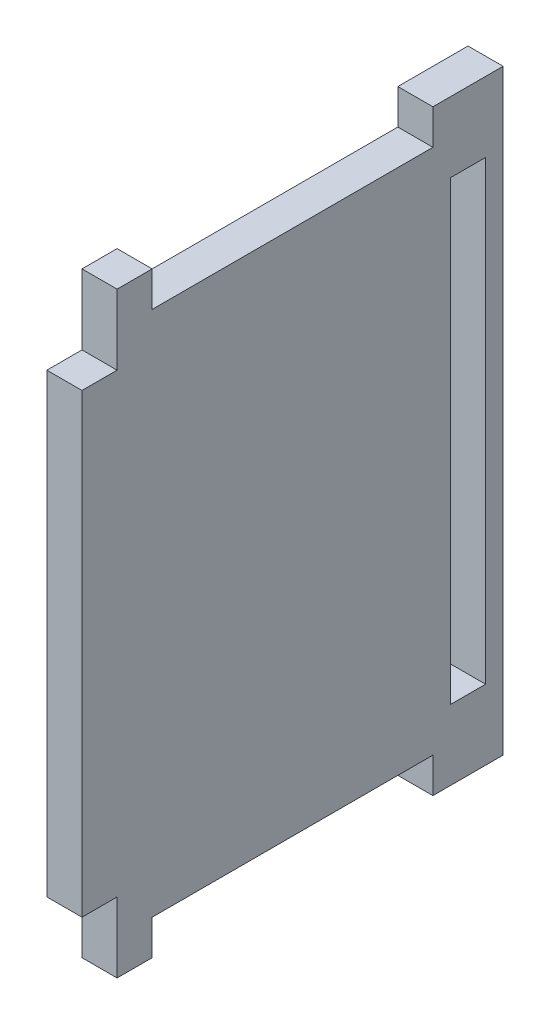
ISO-10303-21;
HEADER;
FILE_DESCRIPTION(('STEP AP214'),'2;1');
FILE_NAME('part.step','',(''),(''),'','','');
FILE_SCHEMA(('AUTOMOTIVE_DESIGN { 1 0 10303 214 1 1 1 1 }'));
ENDSEC;
DATA;
#1=APPLICATION_CONTEXT('core data for automotive mechanical design processes');
#2=APPLICATION_PROTOCOL_DEFINITION('international standard','automotive_design',2000,#1);
#3=PRODUCT_CONTEXT('',#1,'mechanical');
#4=PRODUCT('Part','Part','',(#3));
#5=PRODUCT_RELATED_PRODUCT_CATEGORY('part','',(#4));
#6=PRODUCT_DEFINITION_FORMATION('','',#4);
#7=PRODUCT_DEFINITION_CONTEXT('part definition',#1,'design');
#8=PRODUCT_DEFINITION('design','',#6,#7);
#9=PRODUCT_DEFINITION_SHAPE('','',#8);
#10=(LENGTH_UNIT() NAMED_UNIT(*) SI_UNIT(.MILLI.,.METRE.));
#11=(NAMED_UNIT(*) PLANE_ANGLE_UNIT() SI_UNIT($,.RADIAN.));
#12=(NAMED_UNIT(*) SI_UNIT($,.STERADIAN.) SOLID_ANGLE_UNIT());
#13=UNCERTAINTY_MEASURE_WITH_UNIT(LENGTH_MEASURE(1.E-05),#10,'distance_accuracy_value','');
#14=(GEOMETRIC_REPRESENTATION_CONTEXT(3) GLOBAL_UNCERTAINTY_ASSIGNED_CONTEXT((#13)) GLOBAL_UNIT_ASSIGNED_CONTEXT((#10,
#11,#12)) REPRESENTATION_CONTEXT('',''));
#15=CARTESIAN_POINT('',(0.,0.,0.));
#16=DIRECTION('',(0.,0.,1.));
#17=DIRECTION('',(1.,0.,0.));
#18=AXIS2_PLACEMENT_3D('',#15,#16,#17);
#19=CARTESIAN_POINT('',(82.55,-6.35,184.336603423633));
#20=DIRECTION('',(0.,1.,0.));
#21=DIRECTION('',(-1.,0.,0.));
#22=AXIS2_PLACEMENT_3D('',#19,#20,#21);
#23=PLANE('',#22);
#24=DIRECTION('',(0.,0.,-1.));
#25=VECTOR('',#24,1.);
#26=CARTESIAN_POINT('',(82.55,-6.35,184.336603423633));
#27=LINE('',#26,#25);
#28=CARTESIAN_POINT('',(82.55,-6.35,12.7));
#29=VERTEX_POINT('',#28);
#30=CARTESIAN_POINT('',(82.55,-6.35,0.));
#31=VERTEX_POINT('',#30);
#32=EDGE_CURVE('E311',#29,#31,#27,.T.);
#33=ORIENTED_EDGE('',*,*,#32,.F.);
#34=DIRECTION('',(1.,0.,0.));
#35=VECTOR('',#34,1.);
#36=CARTESIAN_POINT('',(76.2,-6.35,12.7));
#37=LINE('',#36,#35);
#38=CARTESIAN_POINT('',(76.2,-6.35,12.7));
#39=VERTEX_POINT('',#38);
#40=EDGE_CURVE('E201',#39,#29,#37,.T.);
#41=ORIENTED_EDGE('',*,*,#40,.F.);
#42=DIRECTION('',(0.,0.,-1.));
#43=VECTOR('',#42,1.);
#44=CARTESIAN_POINT('',(76.2,-6.35,184.336603423633));
#45=LINE('',#44,#43);
#46=CARTESIAN_POINT('',(76.2,-6.35,0.));
#47=VERTEX_POINT('',#46);
#48=EDGE_CURVE('E192',#39,#47,#45,.T.);
#49=ORIENTED_EDGE('',*,*,#48,.T.);
#50=DIRECTION('',(1.,0.,0.));
#51=VECTOR('',#50,1.);
#52=CARTESIAN_POINT('',(82.55,-6.35,0.));
#53=LINE('',#52,#51);
#54=EDGE_CURVE('E308',#47,#31,#53,.T.);
#55=ORIENTED_EDGE('',*,*,#54,.T.);
#56=EDGE_LOOP('',(#33,#41,#49,#55));
#57=FACE_BOUND('',#56,.T.);
#58=ADVANCED_FACE('F33',(#57),#23,.F.);
#59=CARTESIAN_POINT('',(82.55,101.6,184.336603423633));
#60=DIRECTION('',(0.,-1.,0.));
#61=DIRECTION('',(0.,0.,-1.));
#62=AXIS2_PLACEMENT_3D('',#59,#60,#61);
#63=PLANE('',#62);
#64=DIRECTION('',(0.,0.,-1.));
#65=VECTOR('',#64,1.);
#66=CARTESIAN_POINT('',(82.55,101.6,184.336603423633));
#67=LINE('',#66,#65);
#68=CARTESIAN_POINT('',(82.55,101.6,69.85));
#69=VERTEX_POINT('',#68);
#70=CARTESIAN_POINT('',(82.55,101.6,63.5));
#71=VERTEX_POINT('',#70);
#72=EDGE_CURVE('E37',#69,#71,#67,.T.);
#73=ORIENTED_EDGE('',*,*,#72,.T.);
#74=DIRECTION('',(1.,0.,0.));
#75=VECTOR('',#74,1.);
#76=CARTESIAN_POINT('',(76.2,101.6,63.5));
#77=LINE('',#76,#75);
#78=CARTESIAN_POINT('',(76.2,101.6,63.5));
#79=VERTEX_POINT('',#78);
#80=EDGE_CURVE('E257',#79,#71,#77,.T.);
#81=ORIENTED_EDGE('',*,*,#80,.F.);
#82=DIRECTION('',(0.,0.,-1.));
#83=VECTOR('',#82,1.);
#84=CARTESIAN_POINT('',(76.2,101.6,184.336603423633));
#85=LINE('',#84,#83);
#86=CARTESIAN_POINT('',(76.2,101.6,69.85));
#87=VERTEX_POINT('',#86);
#88=EDGE_CURVE('E318',#87,#79,#85,.T.);
#89=ORIENTED_EDGE('',*,*,#88,.F.);
#90=DIRECTION('',(1.,0.,0.));
#91=VECTOR('',#90,1.);
#92=CARTESIAN_POINT('',(76.2,101.6,69.85));
#93=LINE('',#92,#91);
#94=EDGE_CURVE('E293',#87,#69,#93,.T.);
#95=ORIENTED_EDGE('',*,*,#94,.T.);
#96=EDGE_LOOP('',(#73,#81,#89,#95));
#97=FACE_BOUND('',#96,.T.);
#98=ADVANCED_FACE('F367',(#97),#63,.F.);
#99=CARTESIAN_POINT('',(0.,0.,0.));
#100=DIRECTION('',(0.,0.,1.));
#101=DIRECTION('',(1.,0.,0.));
#102=AXIS2_PLACEMENT_3D('',#99,#100,#101);
#103=PLANE('',#102);
#104=DIRECTION('',(0.,1.,0.));
#105=VECTOR('',#104,1.);
#106=CARTESIAN_POINT('',(82.55,-6.35,0.));
#107=LINE('',#106,#105);
#108=CARTESIAN_POINT('',(82.55,101.6,0.));
#109=VERTEX_POINT('',#108);
#110=EDGE_CURVE('E296',#31,#109,#107,.T.);
#111=ORIENTED_EDGE('',*,*,#110,.F.);
#112=ORIENTED_EDGE('',*,*,#54,.F.);
#113=DIRECTION('',(0.,-1.,0.));
#114=VECTOR('',#113,1.);
#115=CARTESIAN_POINT('',(76.2,-6.35,0.));
#116=LINE('',#115,#114);
#117=CARTESIAN_POINT('',(76.2,101.6,0.));
#118=VERTEX_POINT('',#117);
#119=EDGE_CURVE('E306',#118,#47,#116,.T.);
#120=ORIENTED_EDGE('',*,*,#119,.F.);
#121=DIRECTION('',(-1.,0.,0.));
#122=VECTOR('',#121,1.);
#123=CARTESIAN_POINT('',(82.55,101.6,0.));
#124=LINE('',#123,#122);
#125=EDGE_CURVE('E303',#109,#118,#124,.T.);
#126=ORIENTED_EDGE('',*,*,#125,.F.);
#127=EDGE_LOOP('',(#111,#112,#120,#126));
#128=FACE_BOUND('',#127,.T.);
#129=ADVANCED_FACE('F332',(#128),#103,.F.);
#130=CARTESIAN_POINT('',(76.2,-6.35,69.85));
#131=VERTEX_POINT('',#130);
#132=CARTESIAN_POINT('',(76.2,-6.35,63.5));
#133=VERTEX_POINT('',#132);
#134=EDGE_CURVE('E315',#131,#133,#45,.T.);
#135=ORIENTED_EDGE('',*,*,#134,.T.);
#136=DIRECTION('',(1.,0.,0.));
#137=VECTOR('',#136,1.);
#138=CARTESIAN_POINT('',(76.2,-6.35,63.5));
#139=LINE('',#138,#137);
#140=CARTESIAN_POINT('',(82.55,-6.35,63.5));
#141=VERTEX_POINT('',#140);
#142=EDGE_CURVE('E204',#133,#141,#139,.T.);
#143=ORIENTED_EDGE('',*,*,#142,.T.);
#144=CARTESIAN_POINT('',(82.55,-6.35,69.85));
#145=VERTEX_POINT('',#144);
#146=EDGE_CURVE('E312',#145,#141,#27,.T.);
#147=ORIENTED_EDGE('',*,*,#146,.F.);
#148=DIRECTION('',(1.,0.,0.));
#149=VECTOR('',#148,1.);
#150=CARTESIAN_POINT('',(76.2,-6.35,69.85));
#151=LINE('',#150,#149);
#152=EDGE_CURVE('E271',#131,#145,#151,.T.);
#153=ORIENTED_EDGE('',*,*,#152,.F.);
#154=EDGE_LOOP('',(#135,#143,#147,#153));
#155=FACE_BOUND('',#154,.T.);
#156=ADVANCED_FACE('F342',(#155),#23,.F.);
#157=CARTESIAN_POINT('',(76.2,-6.35,184.336603423633));
#158=DIRECTION('',(1.,0.,0.));
#159=DIRECTION('',(0.,0.,-1.));
#160=AXIS2_PLACEMENT_3D('',#157,#158,#159);
#161=PLANE('',#160);
#162=ORIENTED_EDGE('',*,*,#48,.F.);
#163=DIRECTION('',(0.,1.,0.));
#164=VECTOR('',#163,1.);
#165=CARTESIAN_POINT('',(76.2,-6.35,12.7));
#166=LINE('',#165,#164);
#167=CARTESIAN_POINT('',(76.2,0.,12.7));
#168=VERTEX_POINT('',#167);
#169=EDGE_CURVE('E173',#39,#168,#166,.T.);
#170=ORIENTED_EDGE('',*,*,#169,.T.);
#171=DIRECTION('',(0.,0.,1.));
#172=VECTOR('',#171,1.);
#173=CARTESIAN_POINT('',(76.2,0.,12.7));
#174=LINE('',#173,#172);
#175=CARTESIAN_POINT('',(76.2,0.,63.5));
#176=VERTEX_POINT('',#175);
#177=EDGE_CURVE('E182',#168,#176,#174,.T.);
#178=ORIENTED_EDGE('',*,*,#177,.T.);
#179=DIRECTION('',(0.,-1.,0.));
#180=VECTOR('',#179,1.);
#181=CARTESIAN_POINT('',(76.2,0.,63.5));
#182=LINE('',#181,#180);
#183=EDGE_CURVE('E179',#176,#133,#182,.T.);
#184=ORIENTED_EDGE('',*,*,#183,.T.);
#185=ORIENTED_EDGE('',*,*,#134,.F.);
#186=DIRECTION('',(0.,1.,0.));
#187=VECTOR('',#186,1.);
#188=CARTESIAN_POINT('',(76.2,-6.35,69.85));
#189=LINE('',#188,#187);
#190=CARTESIAN_POINT('',(76.2,6.35,69.85));
#191=VERTEX_POINT('',#190);
#192=EDGE_CURVE('E264',#131,#191,#189,.T.);
#193=ORIENTED_EDGE('',*,*,#192,.T.);
#194=DIRECTION('',(0.,0.,1.));
#195=VECTOR('',#194,1.);
#196=CARTESIAN_POINT('',(76.2,6.35,76.2));
#197=LINE('',#196,#195);
#198=CARTESIAN_POINT('',(76.2,6.35,76.2));
#199=VERTEX_POINT('',#198);
#200=EDGE_CURVE('E267',#191,#199,#197,.T.);
#201=ORIENTED_EDGE('',*,*,#200,.T.);
#202=DIRECTION('',(0.,1.,0.));
#203=VECTOR('',#202,1.);
#204=CARTESIAN_POINT('',(76.2,-6.35,76.2));
#205=LINE('',#204,#203);
#206=CARTESIAN_POINT('',(76.2,88.9,76.2));
#207=VERTEX_POINT('',#206);
#208=EDGE_CURVE('E42',#199,#207,#205,.T.);
#209=ORIENTED_EDGE('',*,*,#208,.T.);
#210=DIRECTION('',(0.,0.,-1.));
#211=VECTOR('',#210,1.);
#212=CARTESIAN_POINT('',(76.2,88.9,76.2));
#213=LINE('',#212,#211);
#214=CARTESIAN_POINT('',(76.2,88.9,69.85));
#215=VERTEX_POINT('',#214);
#216=EDGE_CURVE('E282',#207,#215,#213,.T.);
#217=ORIENTED_EDGE('',*,*,#216,.T.);
#218=DIRECTION('',(0.,1.,0.));
#219=VECTOR('',#218,1.);
#220=CARTESIAN_POINT('',(76.2,101.6,69.85));
#221=LINE('',#220,#219);
#222=EDGE_CURVE('E285',#215,#87,#221,.T.);
#223=ORIENTED_EDGE('',*,*,#222,.T.);
#224=ORIENTED_EDGE('',*,*,#88,.T.);
#225=DIRECTION('',(0.,-1.,0.));
#226=VECTOR('',#225,1.);
#227=CARTESIAN_POINT('',(76.2,101.6,63.5));
#228=LINE('',#227,#226);
#229=CARTESIAN_POINT('',(76.2,95.25,63.5));
#230=VERTEX_POINT('',#229);
#231=EDGE_CURVE('E245',#79,#230,#228,.T.);
#232=ORIENTED_EDGE('',*,*,#231,.T.);
#233=DIRECTION('',(0.,0.,-1.));
#234=VECTOR('',#233,1.);
#235=CARTESIAN_POINT('',(76.2,95.25,63.5));
#236=LINE('',#235,#234);
#237=CARTESIAN_POINT('',(76.2,95.25,12.7));
#238=VERTEX_POINT('',#237);
#239=EDGE_CURVE('E238',#230,#238,#236,.T.);
#240=ORIENTED_EDGE('',*,*,#239,.T.);
#241=DIRECTION('',(0.,1.,0.));
#242=VECTOR('',#241,1.);
#243=CARTESIAN_POINT('',(76.2,95.25,12.7));
#244=LINE('',#243,#242);
#245=CARTESIAN_POINT('',(76.2,101.6,12.7));
#246=VERTEX_POINT('',#245);
#247=EDGE_CURVE('E241',#238,#246,#244,.T.);
#248=ORIENTED_EDGE('',*,*,#247,.T.);
#249=EDGE_CURVE('E317',#246,#118,#85,.T.);
#250=ORIENTED_EDGE('',*,*,#249,.T.);
#251=ORIENTED_EDGE('',*,*,#119,.T.);
#252=EDGE_LOOP('',(#162,#170,#178,#184,#185,#193,#201,#209,#217,#223,#224,#232,#240,#248,#250,#251));
#253=FACE_BOUND('',#252,.T.);
#254=DIRECTION('',(0.,-1.,0.));
#255=VECTOR('',#254,1.);
#256=CARTESIAN_POINT('',(76.2,88.9,9.52499999999998));
#257=LINE('',#256,#255);
#258=CARTESIAN_POINT('',(76.2,88.9,9.52499999999998));
#259=VERTEX_POINT('',#258);
#260=CARTESIAN_POINT('',(76.2,6.34999999999999,9.52499999999997));
#261=VERTEX_POINT('',#260);
#262=EDGE_CURVE('E216',#259,#261,#257,.T.);
#263=ORIENTED_EDGE('',*,*,#262,.T.);
#264=DIRECTION('',(0.,0.,-1.));
#265=VECTOR('',#264,1.);
#266=CARTESIAN_POINT('',(76.2,6.34999999999999,9.52499999999997));
#267=LINE('',#266,#265);
#268=CARTESIAN_POINT('',(76.2,6.34999999999999,3.17499999999997));
#269=VERTEX_POINT('',#268);
#270=EDGE_CURVE('E208',#261,#269,#267,.T.);
#271=ORIENTED_EDGE('',*,*,#270,.T.);
#272=DIRECTION('',(0.,1.,0.));
#273=VECTOR('',#272,1.);
#274=CARTESIAN_POINT('',(76.2,6.34999999999999,3.17499999999997));
#275=LINE('',#274,#273);
#276=CARTESIAN_POINT('',(76.2,88.9,3.17499999999999));
#277=VERTEX_POINT('',#276);
#278=EDGE_CURVE('E211',#269,#277,#275,.T.);
#279=ORIENTED_EDGE('',*,*,#278,.T.);
#280=DIRECTION('',(0.,0.,1.));
#281=VECTOR('',#280,1.);
#282=CARTESIAN_POINT('',(76.2,88.9,3.17499999999998));
#283=LINE('',#282,#281);
#284=EDGE_CURVE('E58',#277,#259,#283,.T.);
#285=ORIENTED_EDGE('',*,*,#284,.T.);
#286=EDGE_LOOP('',(#263,#271,#279,#285));
#287=FACE_BOUND('',#286,.T.);
#288=ADVANCED_FACE('F189',(#253,#287),#161,.F.);
#289=ORIENTED_EDGE('',*,*,#249,.F.);
#290=DIRECTION('',(1.,0.,0.));
#291=VECTOR('',#290,1.);
#292=CARTESIAN_POINT('',(76.2,101.6,12.7));
#293=LINE('',#292,#291);
#294=CARTESIAN_POINT('',(82.55,101.6,12.7));
#295=VERTEX_POINT('',#294);
#296=EDGE_CURVE('E259',#246,#295,#293,.T.);
#297=ORIENTED_EDGE('',*,*,#296,.T.);
#298=EDGE_CURVE('E320',#295,#109,#67,.T.);
#299=ORIENTED_EDGE('',*,*,#298,.T.);
#300=ORIENTED_EDGE('',*,*,#125,.T.);
#301=EDGE_LOOP('',(#289,#297,#299,#300));
#302=FACE_BOUND('',#301,.T.);
#303=ADVANCED_FACE('F328',(#302),#63,.F.);
#304=CARTESIAN_POINT('',(82.55,-6.35,184.336603423633));
#305=DIRECTION('',(-1.,0.,0.));
#306=DIRECTION('',(0.,0.,1.));
#307=AXIS2_PLACEMENT_3D('',#304,#305,#306);
#308=PLANE('',#307);
#309=DIRECTION('',(0.,1.,0.));
#310=VECTOR('',#309,1.);
#311=CARTESIAN_POINT('',(82.55,6.34999999999999,3.17499999999997));
#312=LINE('',#311,#310);
#313=CARTESIAN_POINT('',(82.55,6.34999999999999,3.17499999999998));
#314=VERTEX_POINT('',#313);
#315=CARTESIAN_POINT('',(82.55,88.9,3.17499999999998));
#316=VERTEX_POINT('',#315);
#317=EDGE_CURVE('E221',#314,#316,#312,.T.);
#318=ORIENTED_EDGE('',*,*,#317,.F.);
#319=DIRECTION('',(0.,0.,-1.));
#320=VECTOR('',#319,1.);
#321=CARTESIAN_POINT('',(82.55,6.34999999999999,9.52499999999997));
#322=LINE('',#321,#320);
#323=CARTESIAN_POINT('',(82.55,6.34999999999999,9.52499999999997));
#324=VERTEX_POINT('',#323);
#325=EDGE_CURVE('E203',#324,#314,#322,.T.);
#326=ORIENTED_EDGE('',*,*,#325,.F.);
#327=DIRECTION('',(0.,-1.,0.));
#328=VECTOR('',#327,1.);
#329=CARTESIAN_POINT('',(82.55,88.9,9.52499999999998));
#330=LINE('',#329,#328);
#331=CARTESIAN_POINT('',(82.55,88.9,9.52499999999998));
#332=VERTEX_POINT('',#331);
#333=EDGE_CURVE('E212',#332,#324,#330,.T.);
#334=ORIENTED_EDGE('',*,*,#333,.F.);
#335=DIRECTION('',(0.,0.,1.));
#336=VECTOR('',#335,1.);
#337=CARTESIAN_POINT('',(82.55,88.9,3.17499999999998));
#338=LINE('',#337,#336);
#339=EDGE_CURVE('E224',#316,#332,#338,.T.);
#340=ORIENTED_EDGE('',*,*,#339,.F.);
#341=EDGE_LOOP('',(#318,#326,#334,#340));
#342=FACE_BOUND('',#341,.T.);
#343=DIRECTION('',(0.,0.,1.));
#344=VECTOR('',#343,1.);
#345=CARTESIAN_POINT('',(82.55,0.,12.7));
#346=LINE('',#345,#344);
#347=CARTESIAN_POINT('',(82.55,0.,12.7));
#348=VERTEX_POINT('',#347);
#349=CARTESIAN_POINT('',(82.55,0.,63.5));
#350=VERTEX_POINT('',#349);
#351=EDGE_CURVE('E195',#348,#350,#346,.T.);
#352=ORIENTED_EDGE('',*,*,#351,.F.);
#353=DIRECTION('',(0.,1.,0.));
#354=VECTOR('',#353,1.);
#355=CARTESIAN_POINT('',(82.55,-6.35,12.7));
#356=LINE('',#355,#354);
#357=EDGE_CURVE('E50',#29,#348,#356,.T.);
#358=ORIENTED_EDGE('',*,*,#357,.F.);
#359=ORIENTED_EDGE('',*,*,#32,.T.);
#360=ORIENTED_EDGE('',*,*,#110,.T.);
#361=ORIENTED_EDGE('',*,*,#298,.F.);
#362=DIRECTION('',(0.,1.,0.));
#363=VECTOR('',#362,1.);
#364=CARTESIAN_POINT('',(82.55,95.25,12.7));
#365=LINE('',#364,#363);
#366=CARTESIAN_POINT('',(82.55,95.25,12.7));
#367=VERTEX_POINT('',#366);
#368=EDGE_CURVE('E250',#367,#295,#365,.T.);
#369=ORIENTED_EDGE('',*,*,#368,.F.);
#370=DIRECTION('',(0.,0.,-1.));
#371=VECTOR('',#370,1.);
#372=CARTESIAN_POINT('',(82.55,95.25,63.5));
#373=LINE('',#372,#371);
#374=CARTESIAN_POINT('',(82.55,95.25,63.5));
#375=VERTEX_POINT('',#374);
#376=EDGE_CURVE('E231',#375,#367,#373,.T.);
#377=ORIENTED_EDGE('',*,*,#376,.F.);
#378=DIRECTION('',(0.,-1.,0.));
#379=VECTOR('',#378,1.);
#380=CARTESIAN_POINT('',(82.55,101.6,63.5));
#381=LINE('',#380,#379);
#382=EDGE_CURVE('E242',#71,#375,#381,.T.);
#383=ORIENTED_EDGE('',*,*,#382,.F.);
#384=ORIENTED_EDGE('',*,*,#72,.F.);
#385=DIRECTION('',(0.,1.,0.));
#386=VECTOR('',#385,1.);
#387=CARTESIAN_POINT('',(82.55,101.6,69.85));
#388=LINE('',#387,#386);
#389=CARTESIAN_POINT('',(82.55,88.9,69.85));
#390=VERTEX_POINT('',#389);
#391=EDGE_CURVE('E286',#390,#69,#388,.T.);
#392=ORIENTED_EDGE('',*,*,#391,.F.);
#393=DIRECTION('',(0.,0.,-1.));
#394=VECTOR('',#393,1.);
#395=CARTESIAN_POINT('',(82.55,88.9,76.2));
#396=LINE('',#395,#394);
#397=CARTESIAN_POINT('',(82.55,88.9,76.2));
#398=VERTEX_POINT('',#397);
#399=EDGE_CURVE('E278',#398,#390,#396,.T.);
#400=ORIENTED_EDGE('',*,*,#399,.F.);
#401=DIRECTION('',(0.,-1.,0.));
#402=VECTOR('',#401,1.);
#403=CARTESIAN_POINT('',(82.55,-6.35,76.2));
#404=LINE('',#403,#402);
#405=CARTESIAN_POINT('',(82.55,6.35,76.2));
#406=VERTEX_POINT('',#405);
#407=EDGE_CURVE('E11',#398,#406,#404,.T.);
#408=ORIENTED_EDGE('',*,*,#407,.T.);
#409=DIRECTION('',(0.,0.,1.));
#410=VECTOR('',#409,1.);
#411=CARTESIAN_POINT('',(82.55,6.35,76.2));
#412=LINE('',#411,#410);
#413=CARTESIAN_POINT('',(82.55,6.35,69.85));
#414=VERTEX_POINT('',#413);
#415=EDGE_CURVE('E268',#414,#406,#412,.T.);
#416=ORIENTED_EDGE('',*,*,#415,.F.);
#417=DIRECTION('',(0.,1.,0.));
#418=VECTOR('',#417,1.);
#419=CARTESIAN_POINT('',(82.55,-6.35,69.85));
#420=LINE('',#419,#418);
#421=EDGE_CURVE('E256',#145,#414,#420,.T.);
#422=ORIENTED_EDGE('',*,*,#421,.F.);
#423=ORIENTED_EDGE('',*,*,#146,.T.);
#424=DIRECTION('',(0.,-1.,0.));
#425=VECTOR('',#424,1.);
#426=CARTESIAN_POINT('',(82.55,0.,63.5));
#427=LINE('',#426,#425);
#428=EDGE_CURVE('E193',#350,#141,#427,.T.);
#429=ORIENTED_EDGE('',*,*,#428,.F.);
#430=EDGE_LOOP('',(#352,#358,#359,#360,#361,#369,#377,#383,#384,#392,#400,#408,#416,#422,#423,#429));
#431=FACE_BOUND('',#430,.T.);
#432=ADVANCED_FACE('F35',(#342,#431),#308,.F.);
#433=CARTESIAN_POINT('',(0.,0.,76.2));
#434=DIRECTION('',(0.,0.,-1.));
#435=DIRECTION('',(-1.,0.,0.));
#436=AXIS2_PLACEMENT_3D('',#433,#434,#435);
#437=PLANE('',#436);
#438=ORIENTED_EDGE('',*,*,#208,.F.);
#439=DIRECTION('',(1.,0.,0.));
#440=VECTOR('',#439,1.);
#441=CARTESIAN_POINT('',(76.2,6.35,76.2));
#442=LINE('',#441,#440);
#443=EDGE_CURVE('E275',#199,#406,#442,.T.);
#444=ORIENTED_EDGE('',*,*,#443,.T.);
#445=ORIENTED_EDGE('',*,*,#407,.F.);
#446=DIRECTION('',(1.,0.,0.));
#447=VECTOR('',#446,1.);
#448=CARTESIAN_POINT('',(76.2,88.9,76.2));
#449=LINE('',#448,#447);
#450=EDGE_CURVE('E289',#207,#398,#449,.T.);
#451=ORIENTED_EDGE('',*,*,#450,.F.);
#452=EDGE_LOOP('',(#438,#444,#445,#451));
#453=FACE_BOUND('',#452,.T.);
#454=ADVANCED_FACE('F354',(#453),#437,.F.);
#455=CARTESIAN_POINT('',(76.2,101.6,69.85));
#456=DIRECTION('',(0.,0.,-1.));
#457=DIRECTION('',(-1.,0.,0.));
#458=AXIS2_PLACEMENT_3D('',#455,#456,#457);
#459=PLANE('',#458);
#460=ORIENTED_EDGE('',*,*,#391,.T.);
#461=ORIENTED_EDGE('',*,*,#94,.F.);
#462=ORIENTED_EDGE('',*,*,#222,.F.);
#463=DIRECTION('',(1.,0.,0.));
#464=VECTOR('',#463,1.);
#465=CARTESIAN_POINT('',(76.2,88.9,69.85));
#466=LINE('',#465,#464);
#467=EDGE_CURVE('E297',#215,#390,#466,.T.);
#468=ORIENTED_EDGE('',*,*,#467,.T.);
#469=EDGE_LOOP('',(#460,#461,#462,#468));
#470=FACE_BOUND('',#469,.T.);
#471=ADVANCED_FACE('F407',(#470),#459,.F.);
#472=CARTESIAN_POINT('',(76.2,88.9,76.2));
#473=DIRECTION('',(0.,-1.,0.));
#474=DIRECTION('',(0.,0.,-1.));
#475=AXIS2_PLACEMENT_3D('',#472,#473,#474);
#476=PLANE('',#475);
#477=ORIENTED_EDGE('',*,*,#399,.T.);
#478=ORIENTED_EDGE('',*,*,#467,.F.);
#479=ORIENTED_EDGE('',*,*,#216,.F.);
#480=ORIENTED_EDGE('',*,*,#450,.T.);
#481=EDGE_LOOP('',(#477,#478,#479,#480));
#482=FACE_BOUND('',#481,.T.);
#483=ADVANCED_FACE('F360',(#482),#476,.F.);
#484=CARTESIAN_POINT('',(76.2,6.35,76.2));
#485=DIRECTION('',(0.,1.,0.));
#486=DIRECTION('',(0.,0.,1.));
#487=AXIS2_PLACEMENT_3D('',#484,#485,#486);
#488=PLANE('',#487);
#489=ORIENTED_EDGE('',*,*,#415,.T.);
#490=ORIENTED_EDGE('',*,*,#443,.F.);
#491=ORIENTED_EDGE('',*,*,#200,.F.);
#492=DIRECTION('',(1.,0.,0.));
#493=VECTOR('',#492,1.);
#494=CARTESIAN_POINT('',(76.2,6.35,69.85));
#495=LINE('',#494,#493);
#496=EDGE_CURVE('E279',#191,#414,#495,.T.);
#497=ORIENTED_EDGE('',*,*,#496,.T.);
#498=EDGE_LOOP('',(#489,#490,#491,#497));
#499=FACE_BOUND('',#498,.T.);
#500=ADVANCED_FACE('F351',(#499),#488,.F.);
#501=CARTESIAN_POINT('',(76.2,-6.35,69.85));
#502=DIRECTION('',(0.,0.,-1.));
#503=DIRECTION('',(-1.,0.,0.));
#504=AXIS2_PLACEMENT_3D('',#501,#502,#503);
#505=PLANE('',#504);
#506=ORIENTED_EDGE('',*,*,#421,.T.);
#507=ORIENTED_EDGE('',*,*,#496,.F.);
#508=ORIENTED_EDGE('',*,*,#192,.F.);
#509=ORIENTED_EDGE('',*,*,#152,.T.);
#510=EDGE_LOOP('',(#506,#507,#508,#509));
#511=FACE_BOUND('',#510,.T.);
#512=ADVANCED_FACE('F348',(#511),#505,.F.);
#513=CARTESIAN_POINT('',(76.2,95.25,63.5));
#514=DIRECTION('',(0.,-1.,0.));
#515=DIRECTION('',(0.,0.,-1.));
#516=AXIS2_PLACEMENT_3D('',#513,#514,#515);
#517=PLANE('',#516);
#518=ORIENTED_EDGE('',*,*,#376,.T.);
#519=DIRECTION('',(1.,0.,0.));
#520=VECTOR('',#519,1.);
#521=CARTESIAN_POINT('',(76.2,95.25,12.7));
#522=LINE('',#521,#520);
#523=EDGE_CURVE('E248',#238,#367,#522,.T.);
#524=ORIENTED_EDGE('',*,*,#523,.F.);
#525=ORIENTED_EDGE('',*,*,#239,.F.);
#526=DIRECTION('',(1.,0.,0.));
#527=VECTOR('',#526,1.);
#528=CARTESIAN_POINT('',(76.2,95.25,63.5));
#529=LINE('',#528,#527);
#530=EDGE_CURVE('E254',#230,#375,#529,.T.);
#531=ORIENTED_EDGE('',*,*,#530,.T.);
#532=EDGE_LOOP('',(#518,#524,#525,#531));
#533=FACE_BOUND('',#532,.T.);
#534=ADVANCED_FACE('F374',(#533),#517,.F.);
#535=CARTESIAN_POINT('',(76.2,101.6,63.5));
#536=DIRECTION('',(0.,0.,1.));
#537=DIRECTION('',(1.,0.,0.));
#538=AXIS2_PLACEMENT_3D('',#535,#536,#537);
#539=PLANE('',#538);
#540=ORIENTED_EDGE('',*,*,#382,.T.);
#541=ORIENTED_EDGE('',*,*,#530,.F.);
#542=ORIENTED_EDGE('',*,*,#231,.F.);
#543=ORIENTED_EDGE('',*,*,#80,.T.);
#544=EDGE_LOOP('',(#540,#541,#542,#543));
#545=FACE_BOUND('',#544,.T.);
#546=ADVANCED_FACE('F370',(#545),#539,.F.);
#547=CARTESIAN_POINT('',(76.2,95.25,12.7));
#548=DIRECTION('',(0.,0.,-1.));
#549=DIRECTION('',(-1.,0.,0.));
#550=AXIS2_PLACEMENT_3D('',#547,#548,#549);
#551=PLANE('',#550);
#552=ORIENTED_EDGE('',*,*,#368,.T.);
#553=ORIENTED_EDGE('',*,*,#296,.F.);
#554=ORIENTED_EDGE('',*,*,#247,.F.);
#555=ORIENTED_EDGE('',*,*,#523,.T.);
#556=EDGE_LOOP('',(#552,#553,#554,#555));
#557=FACE_BOUND('',#556,.T.);
#558=ADVANCED_FACE('F377',(#557),#551,.F.);
#559=CARTESIAN_POINT('',(76.2,6.34999999999999,9.52499999999997));
#560=DIRECTION('',(0.,-1.,0.));
#561=DIRECTION('',(0.,0.,-1.));
#562=AXIS2_PLACEMENT_3D('',#559,#560,#561);
#563=PLANE('',#562);
#564=ORIENTED_EDGE('',*,*,#325,.T.);
#565=DIRECTION('',(1.,0.,0.));
#566=VECTOR('',#565,1.);
#567=CARTESIAN_POINT('',(76.2,6.34999999999999,3.17499999999997));
#568=LINE('',#567,#566);
#569=EDGE_CURVE('E219',#269,#314,#568,.T.);
#570=ORIENTED_EDGE('',*,*,#569,.F.);
#571=ORIENTED_EDGE('',*,*,#270,.F.);
#572=DIRECTION('',(1.,0.,0.));
#573=VECTOR('',#572,1.);
#574=CARTESIAN_POINT('',(76.2,6.34999999999999,9.52499999999997));
#575=LINE('',#574,#573);
#576=EDGE_CURVE('E229',#261,#324,#575,.T.);
#577=ORIENTED_EDGE('',*,*,#576,.T.);
#578=EDGE_LOOP('',(#564,#570,#571,#577));
#579=FACE_BOUND('',#578,.T.);
#580=ADVANCED_FACE('F379',(#579),#563,.F.);
#581=CARTESIAN_POINT('',(76.2,88.9,9.52499999999998));
#582=DIRECTION('',(0.,0.,1.));
#583=DIRECTION('',(0.,-1.,0.));
#584=AXIS2_PLACEMENT_3D('',#581,#582,#583);
#585=PLANE('',#584);
#586=ORIENTED_EDGE('',*,*,#333,.T.);
#587=ORIENTED_EDGE('',*,*,#576,.F.);
#588=ORIENTED_EDGE('',*,*,#262,.F.);
#589=DIRECTION('',(1.,0.,0.));
#590=VECTOR('',#589,1.);
#591=CARTESIAN_POINT('',(76.2,88.9,9.52499999999998));
#592=LINE('',#591,#590);
#593=EDGE_CURVE('E232',#259,#332,#592,.T.);
#594=ORIENTED_EDGE('',*,*,#593,.T.);
#595=EDGE_LOOP('',(#586,#587,#588,#594));
#596=FACE_BOUND('',#595,.T.);
#597=ADVANCED_FACE('F385',(#596),#585,.F.);
#598=CARTESIAN_POINT('',(76.2,88.9,3.17499999999998));
#599=DIRECTION('',(0.,1.,0.));
#600=DIRECTION('',(0.,0.,1.));
#601=AXIS2_PLACEMENT_3D('',#598,#599,#600);
#602=PLANE('',#601);
#603=ORIENTED_EDGE('',*,*,#339,.T.);
#604=ORIENTED_EDGE('',*,*,#593,.F.);
#605=ORIENTED_EDGE('',*,*,#284,.F.);
#606=DIRECTION('',(1.,0.,0.));
#607=VECTOR('',#606,1.);
#608=CARTESIAN_POINT('',(76.2,88.9,3.17499999999998));
#609=LINE('',#608,#607);
#610=EDGE_CURVE('E234',#277,#316,#609,.T.);
#611=ORIENTED_EDGE('',*,*,#610,.T.);
#612=EDGE_LOOP('',(#603,#604,#605,#611));
#613=FACE_BOUND('',#612,.T.);
#614=ADVANCED_FACE('F443',(#613),#602,.F.);
#615=CARTESIAN_POINT('',(76.2,6.34999999999999,3.17499999999997));
#616=DIRECTION('',(0.,0.,-1.));
#617=DIRECTION('',(0.,1.,0.));
#618=AXIS2_PLACEMENT_3D('',#615,#616,#617);
#619=PLANE('',#618);
#620=ORIENTED_EDGE('',*,*,#317,.T.);
#621=ORIENTED_EDGE('',*,*,#610,.F.);
#622=ORIENTED_EDGE('',*,*,#278,.F.);
#623=ORIENTED_EDGE('',*,*,#569,.T.);
#624=EDGE_LOOP('',(#620,#621,#622,#623));
#625=FACE_BOUND('',#624,.T.);
#626=ADVANCED_FACE('F453',(#625),#619,.F.);
#627=CARTESIAN_POINT('',(76.2,-6.35,12.7));
#628=DIRECTION('',(0.,0.,-1.));
#629=DIRECTION('',(-1.,0.,0.));
#630=AXIS2_PLACEMENT_3D('',#627,#628,#629);
#631=PLANE('',#630);
#632=ORIENTED_EDGE('',*,*,#357,.T.);
#633=DIRECTION('',(1.,0.,0.));
#634=VECTOR('',#633,1.);
#635=CARTESIAN_POINT('',(76.2,0.,12.7));
#636=LINE('',#635,#634);
#637=EDGE_CURVE('E169',#168,#348,#636,.T.);
#638=ORIENTED_EDGE('',*,*,#637,.F.);
#639=ORIENTED_EDGE('',*,*,#169,.F.);
#640=ORIENTED_EDGE('',*,*,#40,.T.);
#641=EDGE_LOOP('',(#632,#638,#639,#640));
#642=FACE_BOUND('',#641,.T.);
#643=ADVANCED_FACE('F171',(#642),#631,.F.);
#644=CARTESIAN_POINT('',(76.2,0.,63.5));
#645=DIRECTION('',(0.,0.,1.));
#646=DIRECTION('',(1.,0.,0.));
#647=AXIS2_PLACEMENT_3D('',#644,#645,#646);
#648=PLANE('',#647);
#649=ORIENTED_EDGE('',*,*,#428,.T.);
#650=ORIENTED_EDGE('',*,*,#142,.F.);
#651=ORIENTED_EDGE('',*,*,#183,.F.);
#652=DIRECTION('',(1.,0.,0.));
#653=VECTOR('',#652,1.);
#654=CARTESIAN_POINT('',(76.2,0.,63.5));
#655=LINE('',#654,#653);
#656=EDGE_CURVE('E178',#176,#350,#655,.T.);
#657=ORIENTED_EDGE('',*,*,#656,.T.);
#658=EDGE_LOOP('',(#649,#650,#651,#657));
#659=FACE_BOUND('',#658,.T.);
#660=ADVANCED_FACE('F340',(#659),#648,.F.);
#661=CARTESIAN_POINT('',(76.2,0.,12.7));
#662=DIRECTION('',(0.,1.,0.));
#663=DIRECTION('',(0.,0.,1.));
#664=AXIS2_PLACEMENT_3D('',#661,#662,#663);
#665=PLANE('',#664);
#666=ORIENTED_EDGE('',*,*,#351,.T.);
#667=ORIENTED_EDGE('',*,*,#656,.F.);
#668=ORIENTED_EDGE('',*,*,#177,.F.);
#669=ORIENTED_EDGE('',*,*,#637,.T.);
#670=EDGE_LOOP('',(#666,#667,#668,#669));
#671=FACE_BOUND('',#670,.T.);
#672=ADVANCED_FACE('F183',(#671),#665,.F.);
#673=CLOSED_SHELL('',(#58,#98,#129,#156,#288,#303,#432,#454,#471,#483,#500,#512,#534,#546,#558,
#580,#597,#614,#626,#643,#660,#672));
#674=MANIFOLD_SOLID_BREP('B2',#673);
#675=ADVANCED_BREP_SHAPE_REPRESENTATION('',(#18,#674),#14);
#676=SHAPE_DEFINITION_REPRESENTATION(#9,#675);
ENDSEC;
END-ISO-10303-21;
